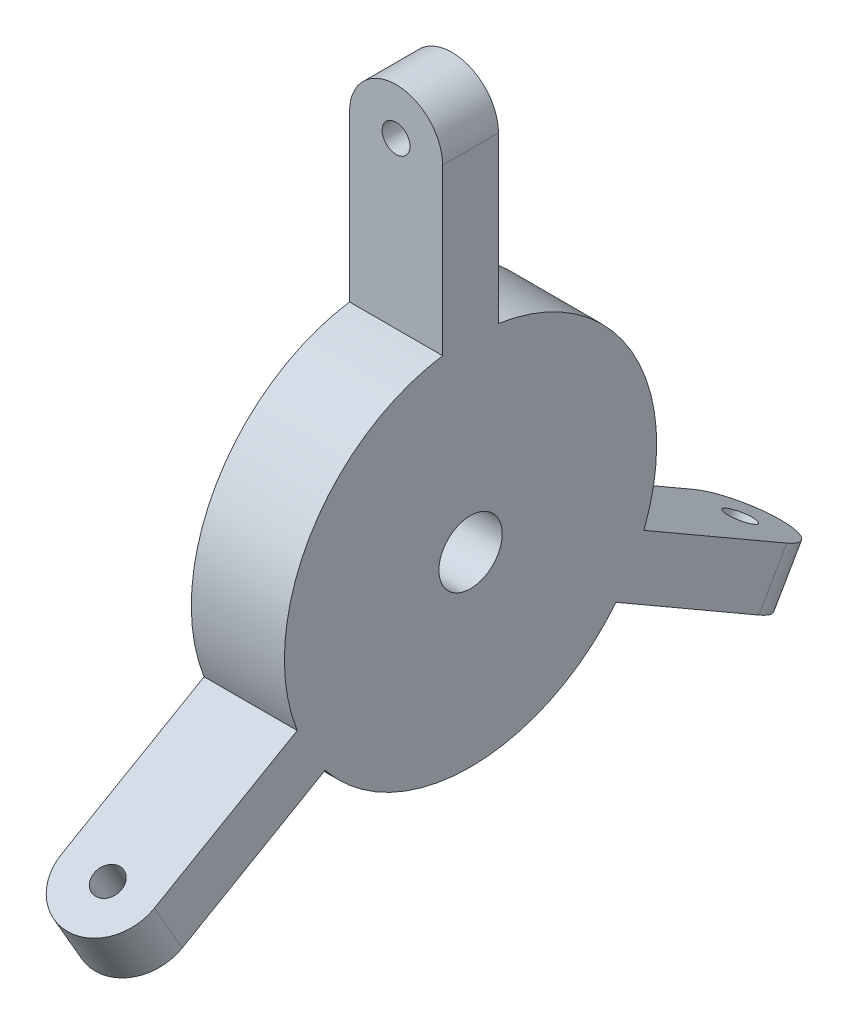
ISO-10303-21;
HEADER;
FILE_DESCRIPTION(('STEP AP214'),'2;1');
FILE_NAME('part.step','',(''),(''),'','','');
FILE_SCHEMA(('AUTOMOTIVE_DESIGN { 1 0 10303 214 1 1 1 1 }'));
ENDSEC;
DATA;
#1=APPLICATION_CONTEXT('core data for automotive mechanical design processes');
#2=APPLICATION_PROTOCOL_DEFINITION('international standard','automotive_design',2000,#1);
#3=PRODUCT_CONTEXT('',#1,'mechanical');
#4=PRODUCT('Part','Part','',(#3));
#5=PRODUCT_RELATED_PRODUCT_CATEGORY('part','',(#4));
#6=PRODUCT_DEFINITION_FORMATION('','',#4);
#7=PRODUCT_DEFINITION_CONTEXT('part definition',#1,'design');
#8=PRODUCT_DEFINITION('design','',#6,#7);
#9=PRODUCT_DEFINITION_SHAPE('','',#8);
#10=(LENGTH_UNIT() NAMED_UNIT(*) SI_UNIT(.MILLI.,.METRE.));
#11=(NAMED_UNIT(*) PLANE_ANGLE_UNIT() SI_UNIT($,.RADIAN.));
#12=(NAMED_UNIT(*) SI_UNIT($,.STERADIAN.) SOLID_ANGLE_UNIT());
#13=UNCERTAINTY_MEASURE_WITH_UNIT(LENGTH_MEASURE(1.E-05),#10,'distance_accuracy_value','');
#14=(GEOMETRIC_REPRESENTATION_CONTEXT(3) GLOBAL_UNCERTAINTY_ASSIGNED_CONTEXT((#13)) GLOBAL_UNIT_ASSIGNED_CONTEXT((#10,
#11,#12)) REPRESENTATION_CONTEXT('',''));
#15=CARTESIAN_POINT('',(0.,0.,0.));
#16=DIRECTION('',(0.,0.,1.));
#17=DIRECTION('',(1.,0.,0.));
#18=AXIS2_PLACEMENT_3D('',#15,#16,#17);
#19=CARTESIAN_POINT('',(-5.,0.,0.));
#20=DIRECTION('',(-1.,0.,0.));
#21=DIRECTION('',(0.,0.,1.));
#22=AXIS2_PLACEMENT_3D('',#19,#20,#21);
#23=PLANE('',#22);
#24=CARTESIAN_POINT('',(-5.,0.,0.));
#25=DIRECTION('',(1.,0.,0.));
#26=DIRECTION('',(0.,0.,1.));
#27=AXIS2_PLACEMENT_3D('',#24,#25,#26);
#28=CIRCLE('',#27,20.);
#29=CARTESIAN_POINT('',(-5.,-7.28878375528928,-18.6245437895437));
#30=VERTEX_POINT('',#29);
#31=CARTESIAN_POINT('',(-5.,19.7737199332852,-3.));
#32=VERTEX_POINT('',#31);
#33=EDGE_CURVE('E156',#30,#32,#28,.T.);
#34=ORIENTED_EDGE('',*,*,#33,.F.);
#35=DIRECTION('',(0.,0.499999999999999,0.866025403784439));
#36=VECTOR('',#35,1.);
#37=CARTESIAN_POINT('',(-5.,-18.6519237886467,-38.3060796608386));
#38=LINE('',#37,#36);
#39=CARTESIAN_POINT('',(-5.,-16.1519237886464,-33.9759526419166));
#40=VERTEX_POINT('',#39);
#41=EDGE_CURVE('E140',#40,#30,#38,.T.);
#42=ORIENTED_EDGE('',*,*,#41,.F.);
#43=DIRECTION('',(0.,0.866025403784443,-0.499999999999992));
#44=VECTOR('',#43,1.);
#45=CARTESIAN_POINT('',(-5.,-53.223076211353,-12.5729128114977));
#46=LINE('',#45,#44);
#47=CARTESIAN_POINT('',(-5.,-21.3480762113533,-30.9759526419165));
#48=VERTEX_POINT('',#47);
#49=EDGE_CURVE('E143',#48,#40,#46,.T.);
#50=ORIENTED_EDGE('',*,*,#49,.F.);
#51=DIRECTION('',(0.,-0.499999999999999,-0.866025403784439));
#52=VECTOR('',#51,1.);
#53=CARTESIAN_POINT('',(-5.,-23.8480762113533,-35.3060796608386));
#54=LINE('',#53,#52);
#55=CARTESIAN_POINT('',(-5.,-12.4849361779959,-15.6245437895437));
#56=VERTEX_POINT('',#55);
#57=EDGE_CURVE('E157',#56,#48,#54,.T.);
#58=ORIENTED_EDGE('',*,*,#57,.F.);
#59=CARTESIAN_POINT('',(-5.,0.,0.));
#60=DIRECTION('',(1.,0.,0.));
#61=DIRECTION('',(0.,0.,1.));
#62=AXIS2_PLACEMENT_3D('',#59,#60,#61);
#63=CIRCLE('',#62,20.);
#64=CARTESIAN_POINT('',(-5.,-12.4849361779959,15.6245437895437));
#65=VERTEX_POINT('',#64);
#66=EDGE_CURVE('E161',#65,#56,#63,.T.);
#67=ORIENTED_EDGE('',*,*,#66,.F.);
#68=DIRECTION('',(0.,0.500000000000001,-0.866025403784438));
#69=VECTOR('',#68,1.);
#70=CARTESIAN_POINT('',(-5.,-23.8480762113533,35.3060796608386));
#71=LINE('',#70,#69);
#72=CARTESIAN_POINT('',(-5.,-21.3480762113535,30.9759526419164));
#73=VERTEX_POINT('',#72);
#74=EDGE_CURVE('E253',#73,#65,#71,.T.);
#75=ORIENTED_EDGE('',*,*,#74,.F.);
#76=DIRECTION('',(0.,-0.866025403784436,-0.500000000000004));
#77=VECTOR('',#76,1.);
#78=CARTESIAN_POINT('',(-5.,29.7120190528381,60.4555123875456));
#79=LINE('',#78,#77);
#80=CARTESIAN_POINT('',(-5.,-16.1519237886467,33.9759526419165));
#81=VERTEX_POINT('',#80);
#82=EDGE_CURVE('E205',#81,#73,#79,.T.);
#83=ORIENTED_EDGE('',*,*,#82,.F.);
#84=DIRECTION('',(0.,-0.500000000000001,0.866025403784438));
#85=VECTOR('',#84,1.);
#86=CARTESIAN_POINT('',(-5.,-18.6519237886467,38.3060796608386));
#87=LINE('',#86,#85);
#88=CARTESIAN_POINT('',(-5.,-7.28878375528928,18.6245437895437));
#89=VERTEX_POINT('',#88);
#90=EDGE_CURVE('E250',#89,#81,#87,.T.);
#91=ORIENTED_EDGE('',*,*,#90,.F.);
#92=CARTESIAN_POINT('',(-5.,0.,0.));
#93=DIRECTION('',(1.,0.,0.));
#94=DIRECTION('',(0.,0.,1.));
#95=AXIS2_PLACEMENT_3D('',#92,#93,#94);
#96=CIRCLE('',#95,20.);
#97=CARTESIAN_POINT('',(-5.,19.7737199332852,3.00000000000001));
#98=VERTEX_POINT('',#97);
#99=EDGE_CURVE('E247',#98,#89,#96,.T.);
#100=ORIENTED_EDGE('',*,*,#99,.F.);
#101=DIRECTION('',(0.,-1.,0.));
#102=VECTOR('',#101,1.);
#103=CARTESIAN_POINT('',(-5.,42.5,3.));
#104=LINE('',#103,#102);
#105=CARTESIAN_POINT('',(-5.,37.5,3.));
#106=VERTEX_POINT('',#105);
#107=EDGE_CURVE('E245',#106,#98,#104,.T.);
#108=ORIENTED_EDGE('',*,*,#107,.F.);
#109=DIRECTION('',(0.,0.,1.));
#110=VECTOR('',#109,1.);
#111=CARTESIAN_POINT('',(-5.,37.5,-38.3060796608386));
#112=LINE('',#111,#110);
#113=CARTESIAN_POINT('',(-5.,37.5,-3.));
#114=VERTEX_POINT('',#113);
#115=EDGE_CURVE('E212',#114,#106,#112,.T.);
#116=ORIENTED_EDGE('',*,*,#115,.F.);
#117=DIRECTION('',(0.,1.,0.));
#118=VECTOR('',#117,1.);
#119=CARTESIAN_POINT('',(-5.,42.5,-3.));
#120=LINE('',#119,#118);
#121=EDGE_CURVE('E159',#32,#114,#120,.T.);
#122=ORIENTED_EDGE('',*,*,#121,.F.);
#123=EDGE_LOOP('',(#34,#42,#50,#58,#67,#75,#83,#91,#100,#108,#116,#122));
#124=FACE_BOUND('',#123,.T.);
#125=CARTESIAN_POINT('',(-5.,0.,0.));
#126=DIRECTION('',(1.,0.,0.));
#127=DIRECTION('',(0.,0.,-1.));
#128=AXIS2_PLACEMENT_3D('',#125,#126,#127);
#129=CIRCLE('',#128,3.4);
#130=CARTESIAN_POINT('',(-5.,0.,-3.4));
#131=VERTEX_POINT('',#130);
#132=EDGE_CURVE('E219',#131,#131,#129,.T.);
#133=ORIENTED_EDGE('',*,*,#132,.T.);
#134=EDGE_LOOP('',(#133));
#135=FACE_BOUND('',#134,.T.);
#136=ADVANCED_FACE('F47',(#124,#135),#23,.T.);
#137=CARTESIAN_POINT('',(5.,0.,0.));
#138=DIRECTION('',(-1.,0.,0.));
#139=DIRECTION('',(0.,0.,1.));
#140=AXIS2_PLACEMENT_3D('',#137,#138,#139);
#141=PLANE('',#140);
#142=CARTESIAN_POINT('',(5.,0.,0.));
#143=DIRECTION('',(1.,0.,0.));
#144=DIRECTION('',(0.,0.,-1.));
#145=AXIS2_PLACEMENT_3D('',#142,#143,#144);
#146=CIRCLE('',#145,3.4);
#147=CARTESIAN_POINT('',(5.,0.,-3.4));
#148=VERTEX_POINT('',#147);
#149=EDGE_CURVE('E216',#148,#148,#146,.T.);
#150=ORIENTED_EDGE('',*,*,#149,.F.);
#151=EDGE_LOOP('',(#150));
#152=FACE_BOUND('',#151,.T.);
#153=CARTESIAN_POINT('',(5.,0.,0.));
#154=DIRECTION('',(1.,0.,0.));
#155=DIRECTION('',(0.,0.,1.));
#156=AXIS2_PLACEMENT_3D('',#153,#154,#155);
#157=CIRCLE('',#156,20.);
#158=CARTESIAN_POINT('',(5.,-12.4849361779959,15.6245437895437));
#159=VERTEX_POINT('',#158);
#160=CARTESIAN_POINT('',(5.,-12.4849361779959,-15.6245437895437));
#161=VERTEX_POINT('',#160);
#162=EDGE_CURVE('E232',#159,#161,#157,.T.);
#163=ORIENTED_EDGE('',*,*,#162,.T.);
#164=DIRECTION('',(0.,-0.499999999999999,-0.866025403784439));
#165=VECTOR('',#164,1.);
#166=CARTESIAN_POINT('',(5.,-23.8480762113533,-35.3060796608386));
#167=LINE('',#166,#165);
#168=CARTESIAN_POINT('',(5.,-21.3480762113533,-30.9759526419165));
#169=VERTEX_POINT('',#168);
#170=EDGE_CURVE('E235',#161,#169,#167,.T.);
#171=ORIENTED_EDGE('',*,*,#170,.T.);
#172=DIRECTION('',(0.,0.866025403784443,-0.499999999999992));
#173=VECTOR('',#172,1.);
#174=CARTESIAN_POINT('',(5.,-53.223076211353,-12.5729128114977));
#175=LINE('',#174,#173);
#176=CARTESIAN_POINT('',(5.,-16.1519237886464,-33.9759526419166));
#177=VERTEX_POINT('',#176);
#178=EDGE_CURVE('E62',#169,#177,#175,.T.);
#179=ORIENTED_EDGE('',*,*,#178,.T.);
#180=DIRECTION('',(0.,0.499999999999999,0.866025403784439));
#181=VECTOR('',#180,1.);
#182=CARTESIAN_POINT('',(5.,-18.6519237886467,-38.3060796608386));
#183=LINE('',#182,#181);
#184=CARTESIAN_POINT('',(5.,-7.28878375528928,-18.6245437895437));
#185=VERTEX_POINT('',#184);
#186=EDGE_CURVE('E142',#177,#185,#183,.T.);
#187=ORIENTED_EDGE('',*,*,#186,.T.);
#188=CARTESIAN_POINT('',(5.,0.,0.));
#189=DIRECTION('',(1.,0.,0.));
#190=DIRECTION('',(0.,0.,1.));
#191=AXIS2_PLACEMENT_3D('',#188,#189,#190);
#192=CIRCLE('',#191,20.);
#193=CARTESIAN_POINT('',(5.,19.7737199332852,-3.));
#194=VERTEX_POINT('',#193);
#195=EDGE_CURVE('E239',#185,#194,#192,.T.);
#196=ORIENTED_EDGE('',*,*,#195,.T.);
#197=DIRECTION('',(0.,1.,0.));
#198=VECTOR('',#197,1.);
#199=CARTESIAN_POINT('',(5.,42.5,-3.));
#200=LINE('',#199,#198);
#201=CARTESIAN_POINT('',(5.,37.5,-3.));
#202=VERTEX_POINT('',#201);
#203=EDGE_CURVE('E242',#194,#202,#200,.T.);
#204=ORIENTED_EDGE('',*,*,#203,.T.);
#205=DIRECTION('',(0.,0.,1.));
#206=VECTOR('',#205,1.);
#207=CARTESIAN_POINT('',(5.,37.5,-38.3060796608386));
#208=LINE('',#207,#206);
#209=CARTESIAN_POINT('',(5.,37.5,3.));
#210=VERTEX_POINT('',#209);
#211=EDGE_CURVE('E170',#210,#202,#208,.F.);
#212=ORIENTED_EDGE('',*,*,#211,.F.);
#213=DIRECTION('',(0.,-1.,0.));
#214=VECTOR('',#213,1.);
#215=CARTESIAN_POINT('',(5.,42.5,3.));
#216=LINE('',#215,#214);
#217=CARTESIAN_POINT('',(5.,19.7737199332852,3.00000000000001));
#218=VERTEX_POINT('',#217);
#219=EDGE_CURVE('E222',#210,#218,#216,.T.);
#220=ORIENTED_EDGE('',*,*,#219,.T.);
#221=CARTESIAN_POINT('',(5.,0.,0.));
#222=DIRECTION('',(1.,0.,0.));
#223=DIRECTION('',(0.,0.,1.));
#224=AXIS2_PLACEMENT_3D('',#221,#222,#223);
#225=CIRCLE('',#224,20.);
#226=CARTESIAN_POINT('',(5.,-7.28878375528928,18.6245437895437));
#227=VERTEX_POINT('',#226);
#228=EDGE_CURVE('E224',#218,#227,#225,.T.);
#229=ORIENTED_EDGE('',*,*,#228,.T.);
#230=DIRECTION('',(0.,-0.500000000000001,0.866025403784438));
#231=VECTOR('',#230,1.);
#232=CARTESIAN_POINT('',(5.,-18.6519237886467,38.3060796608386));
#233=LINE('',#232,#231);
#234=CARTESIAN_POINT('',(5.,-16.1519237886467,33.9759526419165));
#235=VERTEX_POINT('',#234);
#236=EDGE_CURVE('E227',#227,#235,#233,.T.);
#237=ORIENTED_EDGE('',*,*,#236,.T.);
#238=DIRECTION('',(0.,-0.866025403784436,-0.500000000000004));
#239=VECTOR('',#238,1.);
#240=CARTESIAN_POINT('',(5.,29.7120190528381,60.4555123875456));
#241=LINE('',#240,#239);
#242=CARTESIAN_POINT('',(5.,-21.3480762113535,30.9759526419164));
#243=VERTEX_POINT('',#242);
#244=EDGE_CURVE('E70',#235,#243,#241,.T.);
#245=ORIENTED_EDGE('',*,*,#244,.T.);
#246=DIRECTION('',(0.,0.500000000000001,-0.866025403784438));
#247=VECTOR('',#246,1.);
#248=CARTESIAN_POINT('',(5.,-23.8480762113533,35.3060796608386));
#249=LINE('',#248,#247);
#250=EDGE_CURVE('E230',#243,#159,#249,.T.);
#251=ORIENTED_EDGE('',*,*,#250,.T.);
#252=EDGE_LOOP('',(#163,#171,#179,#187,#196,#204,#212,#220,#229,#237,#245,#251));
#253=FACE_BOUND('',#252,.T.);
#254=ADVANCED_FACE('F266',(#152,#253),#141,.F.);
#255=CARTESIAN_POINT('',(-5.,42.5,3.));
#256=DIRECTION('',(0.,0.,1.));
#257=DIRECTION('',(1.,0.,0.));
#258=AXIS2_PLACEMENT_3D('',#255,#256,#257);
#259=PLANE('',#258);
#260=CARTESIAN_POINT('',(0.,37.5,3.));
#261=DIRECTION('',(0.,0.,1.));
#262=DIRECTION('',(1.,0.,0.));
#263=AXIS2_PLACEMENT_3D('',#260,#261,#262);
#264=CIRCLE('',#263,1.5);
#265=CARTESIAN_POINT('',(1.5,37.5,3.));
#266=VERTEX_POINT('',#265);
#267=EDGE_CURVE('E187',#266,#266,#264,.T.);
#268=ORIENTED_EDGE('',*,*,#267,.F.);
#269=EDGE_LOOP('',(#268));
#270=FACE_BOUND('',#269,.T.);
#271=CARTESIAN_POINT('',(0.,37.5,3.));
#272=DIRECTION('',(0.,0.,-1.));
#273=DIRECTION('',(-1.,0.,0.));
#274=AXIS2_PLACEMENT_3D('',#271,#272,#273);
#275=CIRCLE('',#274,5.);
#276=EDGE_CURVE('E186',#106,#210,#275,.T.);
#277=ORIENTED_EDGE('',*,*,#276,.F.);
#278=ORIENTED_EDGE('',*,*,#107,.T.);
#279=DIRECTION('',(1.,0.,0.));
#280=VECTOR('',#279,1.);
#281=CARTESIAN_POINT('',(-5.,19.7737199332852,3.00000000000001));
#282=LINE('',#281,#280);
#283=EDGE_CURVE('E167',#98,#218,#282,.T.);
#284=ORIENTED_EDGE('',*,*,#283,.T.);
#285=ORIENTED_EDGE('',*,*,#219,.F.);
#286=EDGE_LOOP('',(#277,#278,#284,#285));
#287=FACE_BOUND('',#286,.T.);
#288=ADVANCED_FACE('F49',(#270,#287),#259,.T.);
#289=CARTESIAN_POINT('',(-5.,42.5,-3.));
#290=DIRECTION('',(0.,0.,-1.));
#291=DIRECTION('',(-1.,0.,0.));
#292=AXIS2_PLACEMENT_3D('',#289,#290,#291);
#293=PLANE('',#292);
#294=CARTESIAN_POINT('',(0.,37.5,-3.));
#295=DIRECTION('',(0.,0.,-1.));
#296=DIRECTION('',(-1.,0.,0.));
#297=AXIS2_PLACEMENT_3D('',#294,#295,#296);
#298=CIRCLE('',#297,1.5);
#299=CARTESIAN_POINT('',(-1.5,37.5,-3.));
#300=VERTEX_POINT('',#299);
#301=EDGE_CURVE('E183',#300,#300,#298,.T.);
#302=ORIENTED_EDGE('',*,*,#301,.F.);
#303=EDGE_LOOP('',(#302));
#304=FACE_BOUND('',#303,.T.);
#305=CARTESIAN_POINT('',(0.,37.5,-3.));
#306=DIRECTION('',(0.,0.,-1.));
#307=DIRECTION('',(-1.,0.,0.));
#308=AXIS2_PLACEMENT_3D('',#305,#306,#307);
#309=CIRCLE('',#308,5.);
#310=EDGE_CURVE('E214',#202,#114,#309,.F.);
#311=ORIENTED_EDGE('',*,*,#310,.F.);
#312=ORIENTED_EDGE('',*,*,#203,.F.);
#313=DIRECTION('',(1.,0.,0.));
#314=VECTOR('',#313,1.);
#315=CARTESIAN_POINT('',(-5.,19.7737199332852,-3.));
#316=LINE('',#315,#314);
#317=EDGE_CURVE('E168',#32,#194,#316,.T.);
#318=ORIENTED_EDGE('',*,*,#317,.F.);
#319=ORIENTED_EDGE('',*,*,#121,.T.);
#320=EDGE_LOOP('',(#311,#312,#318,#319));
#321=FACE_BOUND('',#320,.T.);
#322=ADVANCED_FACE('F289',(#304,#321),#293,.T.);
#323=CARTESIAN_POINT('',(-5.,0.,0.));
#324=DIRECTION('',(1.,0.,0.));
#325=DIRECTION('',(0.,0.,-1.));
#326=AXIS2_PLACEMENT_3D('',#323,#324,#325);
#327=CYLINDRICAL_SURFACE('',#326,20.);
#328=ORIENTED_EDGE('',*,*,#317,.T.);
#329=ORIENTED_EDGE('',*,*,#195,.F.);
#330=DIRECTION('',(1.,0.,0.));
#331=VECTOR('',#330,1.);
#332=CARTESIAN_POINT('',(-5.,-7.28878375528928,-18.6245437895437));
#333=LINE('',#332,#331);
#334=EDGE_CURVE('E171',#30,#185,#333,.T.);
#335=ORIENTED_EDGE('',*,*,#334,.F.);
#336=ORIENTED_EDGE('',*,*,#33,.T.);
#337=EDGE_LOOP('',(#328,#329,#335,#336));
#338=FACE_BOUND('',#337,.T.);
#339=ADVANCED_FACE('F293',(#338),#327,.T.);
#340=CARTESIAN_POINT('',(-5.,-18.6519237886467,-38.3060796608386));
#341=DIRECTION('',(0.,0.866025403784439,-0.499999999999999));
#342=DIRECTION('',(0.,0.499999999999999,0.866025403784439));
#343=AXIS2_PLACEMENT_3D('',#340,#341,#342);
#344=PLANE('',#343);
#345=CARTESIAN_POINT('',(0.,-16.1519237886464,-33.9759526419166));
#346=DIRECTION('',(0.,0.866025403784443,-0.499999999999992));
#347=DIRECTION('',(1.,0.,0.));
#348=AXIS2_PLACEMENT_3D('',#345,#346,#347);
#349=CIRCLE('',#348,1.5);
#350=CARTESIAN_POINT('',(1.5,-16.1519237886464,-33.9759526419166));
#351=VERTEX_POINT('',#350);
#352=EDGE_CURVE('E144',#351,#351,#349,.T.);
#353=ORIENTED_EDGE('',*,*,#352,.F.);
#354=EDGE_LOOP('',(#353));
#355=FACE_BOUND('',#354,.T.);
#356=CARTESIAN_POINT('',(0.,-16.1519237886464,-33.9759526419166));
#357=DIRECTION('',(0.,-0.866025403784443,0.499999999999992));
#358=DIRECTION('',(-1.,0.,0.));
#359=AXIS2_PLACEMENT_3D('',#356,#357,#358);
#360=CIRCLE('',#359,5.);
#361=EDGE_CURVE('E135',#40,#177,#360,.T.);
#362=ORIENTED_EDGE('',*,*,#361,.F.);
#363=ORIENTED_EDGE('',*,*,#41,.T.);
#364=ORIENTED_EDGE('',*,*,#334,.T.);
#365=ORIENTED_EDGE('',*,*,#186,.F.);
#366=EDGE_LOOP('',(#362,#363,#364,#365));
#367=FACE_BOUND('',#366,.T.);
#368=ADVANCED_FACE('F137',(#355,#367),#344,.T.);
#369=CARTESIAN_POINT('',(-5.,-23.8480762113533,-35.3060796608386));
#370=DIRECTION('',(0.,-0.866025403784439,0.499999999999999));
#371=DIRECTION('',(0.,-0.499999999999999,-0.866025403784439));
#372=AXIS2_PLACEMENT_3D('',#369,#370,#371);
#373=PLANE('',#372);
#374=CARTESIAN_POINT('',(0.,-21.3480762113533,-30.9759526419165));
#375=DIRECTION('',(0.,-0.866025403784439,0.499999999999999));
#376=DIRECTION('',(0.,-0.499999999999999,-0.866025403784439));
#377=AXIS2_PLACEMENT_3D('',#374,#375,#376);
#378=CIRCLE('',#377,1.5);
#379=CARTESIAN_POINT('',(0.,-22.0980762113533,-32.2749907475931));
#380=VERTEX_POINT('',#379);
#381=EDGE_CURVE('E51',#380,#380,#378,.T.);
#382=ORIENTED_EDGE('',*,*,#381,.F.);
#383=EDGE_LOOP('',(#382));
#384=FACE_BOUND('',#383,.T.);
#385=ORIENTED_EDGE('',*,*,#57,.T.);
#386=CARTESIAN_POINT('',(0.,-21.3480762113533,-30.9759526419165));
#387=DIRECTION('',(0.,-0.866025403784439,0.499999999999999));
#388=DIRECTION('',(0.,-0.499999999999999,-0.866025403784439));
#389=AXIS2_PLACEMENT_3D('',#386,#387,#388);
#390=CIRCLE('',#389,5.);
#391=EDGE_CURVE('E13',#169,#48,#390,.F.);
#392=ORIENTED_EDGE('',*,*,#391,.F.);
#393=ORIENTED_EDGE('',*,*,#170,.F.);
#394=DIRECTION('',(1.,0.,0.));
#395=VECTOR('',#394,1.);
#396=CARTESIAN_POINT('',(-5.,-12.4849361779959,-15.6245437895437));
#397=LINE('',#396,#395);
#398=EDGE_CURVE('E173',#56,#161,#397,.T.);
#399=ORIENTED_EDGE('',*,*,#398,.F.);
#400=EDGE_LOOP('',(#385,#392,#393,#399));
#401=FACE_BOUND('',#400,.T.);
#402=ADVANCED_FACE('F263',(#384,#401),#373,.T.);
#403=CARTESIAN_POINT('',(-5.,0.,0.));
#404=DIRECTION('',(1.,0.,0.));
#405=DIRECTION('',(0.,0.,-1.));
#406=AXIS2_PLACEMENT_3D('',#403,#404,#405);
#407=CYLINDRICAL_SURFACE('',#406,20.);
#408=ORIENTED_EDGE('',*,*,#398,.T.);
#409=ORIENTED_EDGE('',*,*,#162,.F.);
#410=DIRECTION('',(1.,0.,0.));
#411=VECTOR('',#410,1.);
#412=CARTESIAN_POINT('',(-5.,-12.4849361779959,15.6245437895437));
#413=LINE('',#412,#411);
#414=EDGE_CURVE('E175',#65,#159,#413,.T.);
#415=ORIENTED_EDGE('',*,*,#414,.F.);
#416=ORIENTED_EDGE('',*,*,#66,.T.);
#417=EDGE_LOOP('',(#408,#409,#415,#416));
#418=FACE_BOUND('',#417,.T.);
#419=ADVANCED_FACE('F258',(#418),#407,.T.);
#420=CARTESIAN_POINT('',(-5.,-23.8480762113533,35.3060796608386));
#421=DIRECTION('',(0.,-0.866025403784438,-0.500000000000001));
#422=DIRECTION('',(0.,0.500000000000001,-0.866025403784438));
#423=AXIS2_PLACEMENT_3D('',#420,#421,#422);
#424=PLANE('',#423);
#425=CARTESIAN_POINT('',(0.,-21.3480762113535,30.9759526419164));
#426=DIRECTION('',(0.,-0.866025403784436,-0.500000000000004));
#427=DIRECTION('',(1.,0.,0.));
#428=AXIS2_PLACEMENT_3D('',#425,#426,#427);
#429=CIRCLE('',#428,1.5);
#430=CARTESIAN_POINT('',(1.5,-21.3480762113535,30.9759526419164));
#431=VERTEX_POINT('',#430);
#432=EDGE_CURVE('E191',#431,#431,#429,.T.);
#433=ORIENTED_EDGE('',*,*,#432,.F.);
#434=EDGE_LOOP('',(#433));
#435=FACE_BOUND('',#434,.T.);
#436=CARTESIAN_POINT('',(0.,-21.3480762113535,30.9759526419164));
#437=DIRECTION('',(0.,0.866025403784436,0.500000000000004));
#438=DIRECTION('',(-1.,0.,0.));
#439=AXIS2_PLACEMENT_3D('',#436,#437,#438);
#440=CIRCLE('',#439,5.);
#441=EDGE_CURVE('E195',#73,#243,#440,.T.);
#442=ORIENTED_EDGE('',*,*,#441,.F.);
#443=ORIENTED_EDGE('',*,*,#74,.T.);
#444=ORIENTED_EDGE('',*,*,#414,.T.);
#445=ORIENTED_EDGE('',*,*,#250,.F.);
#446=EDGE_LOOP('',(#442,#443,#444,#445));
#447=FACE_BOUND('',#446,.T.);
#448=ADVANCED_FACE('F269',(#435,#447),#424,.T.);
#449=CARTESIAN_POINT('',(-5.,-18.6519237886467,38.3060796608386));
#450=DIRECTION('',(0.,0.866025403784438,0.500000000000001));
#451=DIRECTION('',(0.,-0.500000000000001,0.866025403784438));
#452=AXIS2_PLACEMENT_3D('',#449,#450,#451);
#453=PLANE('',#452);
#454=CARTESIAN_POINT('',(0.,-16.1519237886467,33.9759526419165));
#455=DIRECTION('',(0.,0.866025403784438,0.500000000000001));
#456=DIRECTION('',(0.,-0.500000000000001,0.866025403784438));
#457=AXIS2_PLACEMENT_3D('',#454,#455,#456);
#458=CIRCLE('',#457,1.5);
#459=CARTESIAN_POINT('',(0.,-16.9019237886467,35.2749907475931));
#460=VERTEX_POINT('',#459);
#461=EDGE_CURVE('E189',#460,#460,#458,.T.);
#462=ORIENTED_EDGE('',*,*,#461,.F.);
#463=EDGE_LOOP('',(#462));
#464=FACE_BOUND('',#463,.T.);
#465=ORIENTED_EDGE('',*,*,#90,.T.);
#466=CARTESIAN_POINT('',(0.,-16.1519237886467,33.9759526419165));
#467=DIRECTION('',(0.,0.866025403784438,0.500000000000001));
#468=DIRECTION('',(0.,-0.500000000000001,0.866025403784438));
#469=AXIS2_PLACEMENT_3D('',#466,#467,#468);
#470=CIRCLE('',#469,5.);
#471=EDGE_CURVE('E56',#235,#81,#470,.F.);
#472=ORIENTED_EDGE('',*,*,#471,.F.);
#473=ORIENTED_EDGE('',*,*,#236,.F.);
#474=DIRECTION('',(1.,0.,0.));
#475=VECTOR('',#474,1.);
#476=CARTESIAN_POINT('',(-5.,-7.28878375528928,18.6245437895437));
#477=LINE('',#476,#475);
#478=EDGE_CURVE('E178',#89,#227,#477,.T.);
#479=ORIENTED_EDGE('',*,*,#478,.F.);
#480=EDGE_LOOP('',(#465,#472,#473,#479));
#481=FACE_BOUND('',#480,.T.);
#482=ADVANCED_FACE('F274',(#464,#481),#453,.T.);
#483=CARTESIAN_POINT('',(-5.,0.,0.));
#484=DIRECTION('',(1.,0.,0.));
#485=DIRECTION('',(0.,0.,-1.));
#486=AXIS2_PLACEMENT_3D('',#483,#484,#485);
#487=CYLINDRICAL_SURFACE('',#486,20.);
#488=ORIENTED_EDGE('',*,*,#478,.T.);
#489=ORIENTED_EDGE('',*,*,#228,.F.);
#490=ORIENTED_EDGE('',*,*,#283,.F.);
#491=ORIENTED_EDGE('',*,*,#99,.T.);
#492=EDGE_LOOP('',(#488,#489,#490,#491));
#493=FACE_BOUND('',#492,.T.);
#494=ADVANCED_FACE('F278',(#493),#487,.T.);
#495=CARTESIAN_POINT('',(5.,0.,0.));
#496=DIRECTION('',(1.,0.,0.));
#497=DIRECTION('',(0.,0.,-1.));
#498=AXIS2_PLACEMENT_3D('',#495,#496,#497);
#499=CYLINDRICAL_SURFACE('',#498,3.4);
#500=ORIENTED_EDGE('',*,*,#132,.F.);
#501=EDGE_LOOP('',(#500));
#502=FACE_BOUND('',#501,.T.);
#503=ORIENTED_EDGE('',*,*,#149,.T.);
#504=EDGE_LOOP('',(#503));
#505=FACE_BOUND('',#504,.T.);
#506=ADVANCED_FACE('F312',(#502,#505),#499,.F.);
#507=CARTESIAN_POINT('',(0.,37.5,-38.3060796608386));
#508=DIRECTION('',(0.,0.,1.));
#509=DIRECTION('',(1.,0.,0.));
#510=AXIS2_PLACEMENT_3D('',#507,#508,#509);
#511=CYLINDRICAL_SURFACE('',#510,5.);
#512=ORIENTED_EDGE('',*,*,#276,.T.);
#513=ORIENTED_EDGE('',*,*,#211,.T.);
#514=ORIENTED_EDGE('',*,*,#310,.T.);
#515=ORIENTED_EDGE('',*,*,#115,.T.);
#516=EDGE_LOOP('',(#512,#513,#514,#515));
#517=FACE_BOUND('',#516,.T.);
#518=ADVANCED_FACE('F315',(#517),#511,.T.);
#519=CARTESIAN_POINT('',(0.,37.5,-38.3060796608386));
#520=DIRECTION('',(0.,0.,1.));
#521=DIRECTION('',(1.,0.,0.));
#522=AXIS2_PLACEMENT_3D('',#519,#520,#521);
#523=CYLINDRICAL_SURFACE('',#522,1.5);
#524=ORIENTED_EDGE('',*,*,#301,.T.);
#525=EDGE_LOOP('',(#524));
#526=FACE_BOUND('',#525,.T.);
#527=ORIENTED_EDGE('',*,*,#267,.T.);
#528=EDGE_LOOP('',(#527));
#529=FACE_BOUND('',#528,.T.);
#530=ADVANCED_FACE('F319',(#526,#529),#523,.F.);
#531=CARTESIAN_POINT('',(0.,29.7120190528381,60.4555123875456));
#532=DIRECTION('',(0.,-0.866025403784436,-0.500000000000004));
#533=DIRECTION('',(0.,0.500000000000004,-0.866025403784436));
#534=AXIS2_PLACEMENT_3D('',#531,#532,#533);
#535=CYLINDRICAL_SURFACE('',#534,5.);
#536=ORIENTED_EDGE('',*,*,#441,.T.);
#537=ORIENTED_EDGE('',*,*,#244,.F.);
#538=ORIENTED_EDGE('',*,*,#471,.T.);
#539=ORIENTED_EDGE('',*,*,#82,.T.);
#540=EDGE_LOOP('',(#536,#537,#538,#539));
#541=FACE_BOUND('',#540,.T.);
#542=ADVANCED_FACE('F270',(#541),#535,.T.);
#543=CARTESIAN_POINT('',(0.,29.7120190528381,60.4555123875456));
#544=DIRECTION('',(0.,-0.866025403784436,-0.500000000000004));
#545=DIRECTION('',(0.,0.500000000000004,-0.866025403784436));
#546=AXIS2_PLACEMENT_3D('',#543,#544,#545);
#547=CYLINDRICAL_SURFACE('',#546,1.5);
#548=ORIENTED_EDGE('',*,*,#461,.T.);
#549=EDGE_LOOP('',(#548));
#550=FACE_BOUND('',#549,.T.);
#551=ORIENTED_EDGE('',*,*,#432,.T.);
#552=EDGE_LOOP('',(#551));
#553=FACE_BOUND('',#552,.T.);
#554=ADVANCED_FACE('F325',(#550,#553),#547,.F.);
#555=CARTESIAN_POINT('',(0.,-53.223076211353,-12.5729128114977));
#556=DIRECTION('',(0.,0.866025403784443,-0.499999999999992));
#557=DIRECTION('',(0.,0.499999999999992,0.866025403784443));
#558=AXIS2_PLACEMENT_3D('',#555,#556,#557);
#559=CYLINDRICAL_SURFACE('',#558,5.);
#560=ORIENTED_EDGE('',*,*,#361,.T.);
#561=ORIENTED_EDGE('',*,*,#178,.F.);
#562=ORIENTED_EDGE('',*,*,#391,.T.);
#563=ORIENTED_EDGE('',*,*,#49,.T.);
#564=EDGE_LOOP('',(#560,#561,#562,#563));
#565=FACE_BOUND('',#564,.T.);
#566=ADVANCED_FACE('F147',(#565),#559,.T.);
#567=CARTESIAN_POINT('',(0.,-53.223076211353,-12.5729128114977));
#568=DIRECTION('',(0.,0.866025403784443,-0.499999999999992));
#569=DIRECTION('',(0.,0.499999999999992,0.866025403784443));
#570=AXIS2_PLACEMENT_3D('',#567,#568,#569);
#571=CYLINDRICAL_SURFACE('',#570,1.5);
#572=ORIENTED_EDGE('',*,*,#381,.T.);
#573=EDGE_LOOP('',(#572));
#574=FACE_BOUND('',#573,.T.);
#575=ORIENTED_EDGE('',*,*,#352,.T.);
#576=EDGE_LOOP('',(#575));
#577=FACE_BOUND('',#576,.T.);
#578=ADVANCED_FACE('F328',(#574,#577),#571,.F.);
#579=CLOSED_SHELL('',(#136,#254,#288,#322,#339,#368,#402,#419,#448,#482,#494,#506,#518,#530,
#542,#554,#566,#578));
#580=MANIFOLD_SOLID_BREP('B2',#579);
#581=ADVANCED_BREP_SHAPE_REPRESENTATION('',(#18,#580),#14);
#582=SHAPE_DEFINITION_REPRESENTATION(#9,#581);
ENDSEC;
END-ISO-10303-21;
